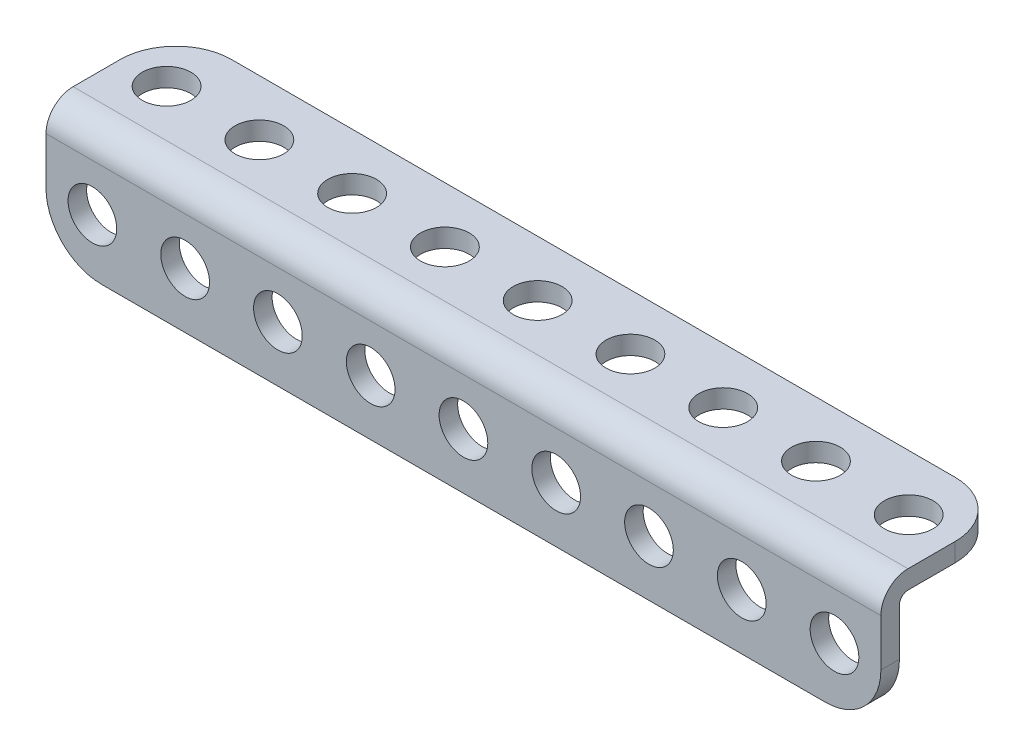
ISO-10303-21;
HEADER;
FILE_DESCRIPTION(('STEP AP214'),'2;1');
FILE_NAME('part.step','',(''),(''),'','','');
FILE_SCHEMA(('AUTOMOTIVE_DESIGN { 1 0 10303 214 1 1 1 1 }'));
ENDSEC;
DATA;
#1=APPLICATION_CONTEXT('core data for automotive mechanical design processes');
#2=APPLICATION_PROTOCOL_DEFINITION('international standard','automotive_design',2000,#1);
#3=PRODUCT_CONTEXT('',#1,'mechanical');
#4=PRODUCT('Part','Part','',(#3));
#5=PRODUCT_RELATED_PRODUCT_CATEGORY('part','',(#4));
#6=PRODUCT_DEFINITION_FORMATION('','',#4);
#7=PRODUCT_DEFINITION_CONTEXT('part definition',#1,'design');
#8=PRODUCT_DEFINITION('design','',#6,#7);
#9=PRODUCT_DEFINITION_SHAPE('','',#8);
#10=(LENGTH_UNIT() NAMED_UNIT(*) SI_UNIT(.MILLI.,.METRE.));
#11=(NAMED_UNIT(*) PLANE_ANGLE_UNIT() SI_UNIT($,.RADIAN.));
#12=(NAMED_UNIT(*) SI_UNIT($,.STERADIAN.) SOLID_ANGLE_UNIT());
#13=UNCERTAINTY_MEASURE_WITH_UNIT(LENGTH_MEASURE(1.E-05),#10,'distance_accuracy_value','');
#14=(GEOMETRIC_REPRESENTATION_CONTEXT(3) GLOBAL_UNCERTAINTY_ASSIGNED_CONTEXT((#13)) GLOBAL_UNIT_ASSIGNED_CONTEXT((#10,
#11,#12)) REPRESENTATION_CONTEXT('',''));
#15=CARTESIAN_POINT('',(0.,0.,0.));
#16=DIRECTION('',(0.,0.,1.));
#17=DIRECTION('',(1.,0.,0.));
#18=AXIS2_PLACEMENT_3D('',#15,#16,#17);
#19=CARTESIAN_POINT('',(16.9449941300397,-6.4,-3.1989870860874));
#20=DIRECTION('',(0.,0.,1.));
#21=DIRECTION('',(1.,0.,0.));
#22=AXIS2_PLACEMENT_3D('',#19,#20,#21);
#23=CYLINDRICAL_SURFACE('',#22,2.1);
#24=CARTESIAN_POINT('',(16.9449941300397,-6.4,-3.1989870860874));
#25=DIRECTION('',(0.,0.,1.));
#26=DIRECTION('',(1.,0.,0.));
#27=AXIS2_PLACEMENT_3D('',#24,#25,#26);
#28=CIRCLE('',#27,2.1);
#29=CARTESIAN_POINT('',(19.0449941300397,-6.4,-3.1989870860874));
#30=VERTEX_POINT('',#29);
#31=EDGE_CURVE('E264',#30,#30,#28,.F.);
#32=ORIENTED_EDGE('',*,*,#31,.T.);
#33=EDGE_LOOP('',(#32));
#34=FACE_BOUND('',#33,.T.);
#35=CARTESIAN_POINT('',(16.9449941300397,-6.4,-1.5989870860874));
#36=DIRECTION('',(0.,0.,1.));
#37=DIRECTION('',(1.,0.,0.));
#38=AXIS2_PLACEMENT_3D('',#35,#36,#37);
#39=CIRCLE('',#38,2.1);
#40=CARTESIAN_POINT('',(19.0449941300397,-6.4,-1.5989870860874));
#41=VERTEX_POINT('',#40);
#42=EDGE_CURVE('E294',#41,#41,#39,.F.);
#43=ORIENTED_EDGE('',*,*,#42,.F.);
#44=EDGE_LOOP('',(#43));
#45=FACE_BOUND('',#44,.T.);
#46=ADVANCED_FACE('F16',(#34,#45),#23,.F.);
#47=CARTESIAN_POINT('',(8.94499413003972,-6.4,-3.1989870860874));
#48=DIRECTION('',(0.,0.,1.));
#49=DIRECTION('',(1.,0.,0.));
#50=AXIS2_PLACEMENT_3D('',#47,#48,#49);
#51=CYLINDRICAL_SURFACE('',#50,2.1);
#52=CARTESIAN_POINT('',(8.94499413003972,-6.4,-3.1989870860874));
#53=DIRECTION('',(0.,0.,1.));
#54=DIRECTION('',(1.,0.,0.));
#55=AXIS2_PLACEMENT_3D('',#52,#53,#54);
#56=CIRCLE('',#55,2.1);
#57=CARTESIAN_POINT('',(11.0449941300397,-6.4,-3.1989870860874));
#58=VERTEX_POINT('',#57);
#59=EDGE_CURVE('E261',#58,#58,#56,.F.);
#60=ORIENTED_EDGE('',*,*,#59,.T.);
#61=EDGE_LOOP('',(#60));
#62=FACE_BOUND('',#61,.T.);
#63=CARTESIAN_POINT('',(8.94499413003972,-6.4,-1.5989870860874));
#64=DIRECTION('',(0.,0.,1.));
#65=DIRECTION('',(1.,0.,0.));
#66=AXIS2_PLACEMENT_3D('',#63,#64,#65);
#67=CIRCLE('',#66,2.1);
#68=CARTESIAN_POINT('',(11.0449941300397,-6.4,-1.5989870860874));
#69=VERTEX_POINT('',#68);
#70=EDGE_CURVE('E291',#69,#69,#67,.F.);
#71=ORIENTED_EDGE('',*,*,#70,.F.);
#72=EDGE_LOOP('',(#71));
#73=FACE_BOUND('',#72,.T.);
#74=ADVANCED_FACE('F625',(#62,#73),#51,.F.);
#75=CARTESIAN_POINT('',(0.94499413003972,-6.4,-3.1989870860874));
#76=DIRECTION('',(0.,0.,1.));
#77=DIRECTION('',(1.,0.,0.));
#78=AXIS2_PLACEMENT_3D('',#75,#76,#77);
#79=CYLINDRICAL_SURFACE('',#78,2.1);
#80=CARTESIAN_POINT('',(0.94499413003972,-6.4,-3.1989870860874));
#81=DIRECTION('',(0.,0.,1.));
#82=DIRECTION('',(1.,0.,0.));
#83=AXIS2_PLACEMENT_3D('',#80,#81,#82);
#84=CIRCLE('',#83,2.1);
#85=CARTESIAN_POINT('',(3.04499413003972,-6.4,-3.1989870860874));
#86=VERTEX_POINT('',#85);
#87=EDGE_CURVE('E258',#86,#86,#84,.F.);
#88=ORIENTED_EDGE('',*,*,#87,.T.);
#89=EDGE_LOOP('',(#88));
#90=FACE_BOUND('',#89,.T.);
#91=CARTESIAN_POINT('',(0.94499413003972,-6.4,-1.5989870860874));
#92=DIRECTION('',(0.,0.,1.));
#93=DIRECTION('',(1.,0.,0.));
#94=AXIS2_PLACEMENT_3D('',#91,#92,#93);
#95=CIRCLE('',#94,2.1);
#96=CARTESIAN_POINT('',(3.04499413003972,-6.4,-1.5989870860874));
#97=VERTEX_POINT('',#96);
#98=EDGE_CURVE('E288',#97,#97,#95,.F.);
#99=ORIENTED_EDGE('',*,*,#98,.F.);
#100=EDGE_LOOP('',(#99));
#101=FACE_BOUND('',#100,.T.);
#102=ADVANCED_FACE('F616',(#90,#101),#79,.F.);
#103=CARTESIAN_POINT('',(-7.05500586996028,-6.4,-3.1989870860874));
#104=DIRECTION('',(0.,0.,1.));
#105=DIRECTION('',(1.,0.,0.));
#106=AXIS2_PLACEMENT_3D('',#103,#104,#105);
#107=CYLINDRICAL_SURFACE('',#106,2.1);
#108=CARTESIAN_POINT('',(-7.05500586996028,-6.4,-3.1989870860874));
#109=DIRECTION('',(0.,0.,1.));
#110=DIRECTION('',(1.,0.,0.));
#111=AXIS2_PLACEMENT_3D('',#108,#109,#110);
#112=CIRCLE('',#111,2.1);
#113=CARTESIAN_POINT('',(-4.95500586996028,-6.4,-3.1989870860874));
#114=VERTEX_POINT('',#113);
#115=EDGE_CURVE('E255',#114,#114,#112,.F.);
#116=ORIENTED_EDGE('',*,*,#115,.T.);
#117=EDGE_LOOP('',(#116));
#118=FACE_BOUND('',#117,.T.);
#119=CARTESIAN_POINT('',(-7.05500586996028,-6.4,-1.5989870860874));
#120=DIRECTION('',(0.,0.,1.));
#121=DIRECTION('',(1.,0.,0.));
#122=AXIS2_PLACEMENT_3D('',#119,#120,#121);
#123=CIRCLE('',#122,2.1);
#124=CARTESIAN_POINT('',(-4.95500586996028,-6.4,-1.5989870860874));
#125=VERTEX_POINT('',#124);
#126=EDGE_CURVE('E285',#125,#125,#123,.F.);
#127=ORIENTED_EDGE('',*,*,#126,.F.);
#128=EDGE_LOOP('',(#127));
#129=FACE_BOUND('',#128,.T.);
#130=ADVANCED_FACE('F607',(#118,#129),#107,.F.);
#131=CARTESIAN_POINT('',(-15.0550058699603,-6.4,-3.1989870860874));
#132=DIRECTION('',(0.,0.,1.));
#133=DIRECTION('',(1.,0.,0.));
#134=AXIS2_PLACEMENT_3D('',#131,#132,#133);
#135=CYLINDRICAL_SURFACE('',#134,2.1);
#136=CARTESIAN_POINT('',(-15.0550058699603,-6.4,-3.1989870860874));
#137=DIRECTION('',(0.,0.,1.));
#138=DIRECTION('',(1.,0.,0.));
#139=AXIS2_PLACEMENT_3D('',#136,#137,#138);
#140=CIRCLE('',#139,2.1);
#141=CARTESIAN_POINT('',(-12.9550058699603,-6.4,-3.1989870860874));
#142=VERTEX_POINT('',#141);
#143=EDGE_CURVE('E252',#142,#142,#140,.F.);
#144=ORIENTED_EDGE('',*,*,#143,.T.);
#145=EDGE_LOOP('',(#144));
#146=FACE_BOUND('',#145,.T.);
#147=CARTESIAN_POINT('',(-15.0550058699603,-6.4,-1.5989870860874));
#148=DIRECTION('',(0.,0.,1.));
#149=DIRECTION('',(1.,0.,0.));
#150=AXIS2_PLACEMENT_3D('',#147,#148,#149);
#151=CIRCLE('',#150,2.1);
#152=CARTESIAN_POINT('',(-12.9550058699603,-6.4,-1.5989870860874));
#153=VERTEX_POINT('',#152);
#154=EDGE_CURVE('E282',#153,#153,#151,.F.);
#155=ORIENTED_EDGE('',*,*,#154,.F.);
#156=EDGE_LOOP('',(#155));
#157=FACE_BOUND('',#156,.T.);
#158=ADVANCED_FACE('F598',(#146,#157),#135,.F.);
#159=CARTESIAN_POINT('',(-23.0550058699603,-6.4,-3.1989870860874));
#160=DIRECTION('',(0.,0.,1.));
#161=DIRECTION('',(1.,0.,0.));
#162=AXIS2_PLACEMENT_3D('',#159,#160,#161);
#163=CYLINDRICAL_SURFACE('',#162,2.1);
#164=CARTESIAN_POINT('',(-23.0550058699603,-6.4,-3.1989870860874));
#165=DIRECTION('',(0.,0.,1.));
#166=DIRECTION('',(1.,0.,0.));
#167=AXIS2_PLACEMENT_3D('',#164,#165,#166);
#168=CIRCLE('',#167,2.1);
#169=CARTESIAN_POINT('',(-20.9550058699603,-6.4,-3.1989870860874));
#170=VERTEX_POINT('',#169);
#171=EDGE_CURVE('E249',#170,#170,#168,.F.);
#172=ORIENTED_EDGE('',*,*,#171,.T.);
#173=EDGE_LOOP('',(#172));
#174=FACE_BOUND('',#173,.T.);
#175=CARTESIAN_POINT('',(-23.0550058699603,-6.4,-1.5989870860874));
#176=DIRECTION('',(0.,0.,1.));
#177=DIRECTION('',(1.,0.,0.));
#178=AXIS2_PLACEMENT_3D('',#175,#176,#177);
#179=CIRCLE('',#178,2.1);
#180=CARTESIAN_POINT('',(-20.9550058699603,-6.4,-1.5989870860874));
#181=VERTEX_POINT('',#180);
#182=EDGE_CURVE('E279',#181,#181,#179,.F.);
#183=ORIENTED_EDGE('',*,*,#182,.F.);
#184=EDGE_LOOP('',(#183));
#185=FACE_BOUND('',#184,.T.);
#186=ADVANCED_FACE('F355',(#174,#185),#163,.F.);
#187=CARTESIAN_POINT('',(-31.0550058699603,-6.4,-3.1989870860874));
#188=DIRECTION('',(0.,0.,1.));
#189=DIRECTION('',(1.,0.,0.));
#190=AXIS2_PLACEMENT_3D('',#187,#188,#189);
#191=CYLINDRICAL_SURFACE('',#190,2.1);
#192=CARTESIAN_POINT('',(-31.0550058699603,-6.4,-3.1989870860874));
#193=DIRECTION('',(0.,0.,1.));
#194=DIRECTION('',(1.,0.,0.));
#195=AXIS2_PLACEMENT_3D('',#192,#193,#194);
#196=CIRCLE('',#195,2.1);
#197=CARTESIAN_POINT('',(-28.9550058699603,-6.4,-3.1989870860874));
#198=VERTEX_POINT('',#197);
#199=EDGE_CURVE('E122',#198,#198,#196,.F.);
#200=ORIENTED_EDGE('',*,*,#199,.T.);
#201=EDGE_LOOP('',(#200));
#202=FACE_BOUND('',#201,.T.);
#203=CARTESIAN_POINT('',(-31.0550058699603,-6.4,-1.5989870860874));
#204=DIRECTION('',(0.,0.,1.));
#205=DIRECTION('',(1.,0.,0.));
#206=AXIS2_PLACEMENT_3D('',#203,#204,#205);
#207=CIRCLE('',#206,2.1);
#208=CARTESIAN_POINT('',(-28.9550058699603,-6.4,-1.5989870860874));
#209=VERTEX_POINT('',#208);
#210=EDGE_CURVE('E276',#209,#209,#207,.F.);
#211=ORIENTED_EDGE('',*,*,#210,.F.);
#212=EDGE_LOOP('',(#211));
#213=FACE_BOUND('',#212,.T.);
#214=ADVANCED_FACE('F347',(#202,#213),#191,.F.);
#215=CARTESIAN_POINT('',(-46.2550058699603,-6.4,-11.5989870860874));
#216=DIRECTION('',(0.,0.,1.));
#217=DIRECTION('',(1.,0.,0.));
#218=AXIS2_PLACEMENT_3D('',#215,#216,#217);
#219=CYLINDRICAL_SURFACE('',#218,4.8);
#220=CARTESIAN_POINT('',(-46.2550058699603,-6.4,-1.59898708608737));
#221=DIRECTION('',(0.,0.,1.));
#222=DIRECTION('',(1.,0.,0.));
#223=AXIS2_PLACEMENT_3D('',#220,#221,#222);
#224=CIRCLE('',#223,4.8);
#225=CARTESIAN_POINT('',(-51.0550058699603,-6.4,-1.59898708608738));
#226=VERTEX_POINT('',#225);
#227=CARTESIAN_POINT('',(-46.2550058699603,-11.2,-1.59898708608736));
#228=VERTEX_POINT('',#227);
#229=EDGE_CURVE('E172',#226,#228,#224,.T.);
#230=ORIENTED_EDGE('',*,*,#229,.F.);
#231=DIRECTION('',(0.,0.,1.));
#232=VECTOR('',#231,1.);
#233=CARTESIAN_POINT('',(-51.0550058699603,-6.4,-11.5989870860874));
#234=LINE('',#233,#232);
#235=CARTESIAN_POINT('',(-51.0550058699603,-6.4,-3.19898708608738));
#236=VERTEX_POINT('',#235);
#237=EDGE_CURVE('E179',#226,#236,#234,.F.);
#238=ORIENTED_EDGE('',*,*,#237,.T.);
#239=CARTESIAN_POINT('',(-46.2550058699603,-6.4,-3.19898708608738));
#240=DIRECTION('',(0.,0.,1.));
#241=DIRECTION('',(1.,0.,0.));
#242=AXIS2_PLACEMENT_3D('',#239,#240,#241);
#243=CIRCLE('',#242,4.8);
#244=CARTESIAN_POINT('',(-46.2550058699603,-11.2,-3.19898708608737));
#245=VERTEX_POINT('',#244);
#246=EDGE_CURVE('E121',#236,#245,#243,.T.);
#247=ORIENTED_EDGE('',*,*,#246,.T.);
#248=DIRECTION('',(0.,0.,1.));
#249=VECTOR('',#248,1.);
#250=CARTESIAN_POINT('',(-46.2550058699603,-11.2,-11.5989870860874));
#251=LINE('',#250,#249);
#252=EDGE_CURVE('E175',#245,#228,#251,.T.);
#253=ORIENTED_EDGE('',*,*,#252,.T.);
#254=EDGE_LOOP('',(#230,#238,#247,#253));
#255=FACE_BOUND('',#254,.T.);
#256=ADVANCED_FACE('F345',(#255),#219,.T.);
#257=CARTESIAN_POINT('',(-54.6727360152985,-11.2,-11.5989870860874));
#258=DIRECTION('',(0.,1.,0.));
#259=DIRECTION('',(0.,0.,1.));
#260=AXIS2_PLACEMENT_3D('',#257,#258,#259);
#261=PLANE('',#260);
#262=DIRECTION('',(1.,0.,0.));
#263=VECTOR('',#262,1.);
#264=CARTESIAN_POINT('',(-51.0550058699603,-11.2,-1.59898708608735));
#265=LINE('',#264,#263);
#266=CARTESIAN_POINT('',(16.1449941300397,-11.2,-1.59898708608737));
#267=VERTEX_POINT('',#266);
#268=EDGE_CURVE('E169',#228,#267,#265,.T.);
#269=ORIENTED_EDGE('',*,*,#268,.F.);
#270=ORIENTED_EDGE('',*,*,#252,.F.);
#271=DIRECTION('',(1.,0.,0.));
#272=VECTOR('',#271,1.);
#273=CARTESIAN_POINT('',(-51.0550058699603,-11.2,-3.19898708608735));
#274=LINE('',#273,#272);
#275=CARTESIAN_POINT('',(16.1449941300397,-11.2,-3.19898708608736));
#276=VERTEX_POINT('',#275);
#277=EDGE_CURVE('E160',#245,#276,#274,.T.);
#278=ORIENTED_EDGE('',*,*,#277,.T.);
#279=DIRECTION('',(0.,0.,-1.));
#280=VECTOR('',#279,1.);
#281=CARTESIAN_POINT('',(16.1449941300397,-11.2,-11.5989870860874));
#282=LINE('',#281,#280);
#283=EDGE_CURVE('E173',#267,#276,#282,.T.);
#284=ORIENTED_EDGE('',*,*,#283,.F.);
#285=EDGE_LOOP('',(#269,#270,#278,#284));
#286=FACE_BOUND('',#285,.T.);
#287=ADVANCED_FACE('F342',(#286),#261,.F.);
#288=CARTESIAN_POINT('',(16.1449941300397,-6.4,-11.5989870860874));
#289=DIRECTION('',(0.,0.,-1.));
#290=DIRECTION('',(-1.,0.,0.));
#291=AXIS2_PLACEMENT_3D('',#288,#289,#290);
#292=CYLINDRICAL_SURFACE('',#291,4.8);
#293=CARTESIAN_POINT('',(16.1449941300397,-6.4,-3.19898708608736));
#294=DIRECTION('',(0.,0.,-1.));
#295=DIRECTION('',(-1.,0.,0.));
#296=AXIS2_PLACEMENT_3D('',#293,#294,#295);
#297=CIRCLE('',#296,4.8);
#298=CARTESIAN_POINT('',(20.9449941300397,-6.4,-3.19898708608736));
#299=VERTEX_POINT('',#298);
#300=EDGE_CURVE('E162',#276,#299,#297,.F.);
#301=ORIENTED_EDGE('',*,*,#300,.T.);
#302=DIRECTION('',(0.,0.,-1.));
#303=VECTOR('',#302,1.);
#304=CARTESIAN_POINT('',(20.9449941300397,-6.4,-11.5989870860874));
#305=LINE('',#304,#303);
#306=CARTESIAN_POINT('',(20.9449941300397,-6.4,-1.59898708608738));
#307=VERTEX_POINT('',#306);
#308=EDGE_CURVE('E114',#299,#307,#305,.F.);
#309=ORIENTED_EDGE('',*,*,#308,.T.);
#310=CARTESIAN_POINT('',(16.1449941300397,-6.4,-1.59898708608738));
#311=DIRECTION('',(0.,0.,-1.));
#312=DIRECTION('',(-1.,0.,0.));
#313=AXIS2_PLACEMENT_3D('',#310,#311,#312);
#314=CIRCLE('',#313,4.8);
#315=EDGE_CURVE('E171',#267,#307,#314,.F.);
#316=ORIENTED_EDGE('',*,*,#315,.F.);
#317=ORIENTED_EDGE('',*,*,#283,.T.);
#318=EDGE_LOOP('',(#301,#309,#316,#317));
#319=FACE_BOUND('',#318,.T.);
#320=ADVANCED_FACE('F338',(#319),#292,.T.);
#321=CARTESIAN_POINT('',(-47.0550058699603,-6.4,-3.1989870860874));
#322=DIRECTION('',(0.,0.,1.));
#323=DIRECTION('',(1.,0.,0.));
#324=AXIS2_PLACEMENT_3D('',#321,#322,#323);
#325=CYLINDRICAL_SURFACE('',#324,2.1);
#326=CARTESIAN_POINT('',(-47.0550058699603,-6.4,-3.1989870860874));
#327=DIRECTION('',(0.,0.,1.));
#328=DIRECTION('',(1.,0.,0.));
#329=AXIS2_PLACEMENT_3D('',#326,#327,#328);
#330=CIRCLE('',#329,2.1);
#331=CARTESIAN_POINT('',(-44.9550058699603,-6.4,-3.1989870860874));
#332=VERTEX_POINT('',#331);
#333=EDGE_CURVE('E241',#332,#332,#330,.F.);
#334=ORIENTED_EDGE('',*,*,#333,.T.);
#335=EDGE_LOOP('',(#334));
#336=FACE_BOUND('',#335,.T.);
#337=CARTESIAN_POINT('',(-47.0550058699603,-6.4,-1.5989870860874));
#338=DIRECTION('',(0.,0.,1.));
#339=DIRECTION('',(1.,0.,0.));
#340=AXIS2_PLACEMENT_3D('',#337,#338,#339);
#341=CIRCLE('',#340,2.1);
#342=CARTESIAN_POINT('',(-44.9550058699603,-6.4,-1.5989870860874));
#343=VERTEX_POINT('',#342);
#344=EDGE_CURVE('E273',#343,#343,#341,.F.);
#345=ORIENTED_EDGE('',*,*,#344,.F.);
#346=EDGE_LOOP('',(#345));
#347=FACE_BOUND('',#346,.T.);
#348=ADVANCED_FACE('F428',(#336,#347),#325,.F.);
#349=CARTESIAN_POINT('',(-39.0550058699603,-6.4,-3.1989870860874));
#350=DIRECTION('',(0.,0.,1.));
#351=DIRECTION('',(1.,0.,0.));
#352=AXIS2_PLACEMENT_3D('',#349,#350,#351);
#353=CYLINDRICAL_SURFACE('',#352,2.1);
#354=CARTESIAN_POINT('',(-39.0550058699603,-6.4,-3.1989870860874));
#355=DIRECTION('',(0.,0.,1.));
#356=DIRECTION('',(1.,0.,0.));
#357=AXIS2_PLACEMENT_3D('',#354,#355,#356);
#358=CIRCLE('',#357,2.1);
#359=CARTESIAN_POINT('',(-36.9550058699603,-6.4,-3.1989870860874));
#360=VERTEX_POINT('',#359);
#361=EDGE_CURVE('E167',#360,#360,#358,.F.);
#362=ORIENTED_EDGE('',*,*,#361,.T.);
#363=EDGE_LOOP('',(#362));
#364=FACE_BOUND('',#363,.T.);
#365=CARTESIAN_POINT('',(-39.0550058699603,-6.4,-1.5989870860874));
#366=DIRECTION('',(0.,0.,1.));
#367=DIRECTION('',(1.,0.,0.));
#368=AXIS2_PLACEMENT_3D('',#365,#366,#367);
#369=CIRCLE('',#368,2.1);
#370=CARTESIAN_POINT('',(-36.9550058699603,-6.4,-1.5989870860874));
#371=VERTEX_POINT('',#370);
#372=EDGE_CURVE('E270',#371,#371,#369,.F.);
#373=ORIENTED_EDGE('',*,*,#372,.F.);
#374=EDGE_LOOP('',(#373));
#375=FACE_BOUND('',#374,.T.);
#376=ADVANCED_FACE('F425',(#364,#375),#353,.F.);
#377=CARTESIAN_POINT('',(-51.0550058699603,-2.3366,-3.93558708608739));
#378=DIRECTION('',(-1.,0.,0.));
#379=DIRECTION('',(0.,0.,1.));
#380=AXIS2_PLACEMENT_3D('',#377,#378,#379);
#381=CYLINDRICAL_SURFACE('',#380,0.736599999999995);
#382=DIRECTION('',(1.,0.,0.));
#383=VECTOR('',#382,1.);
#384=CARTESIAN_POINT('',(-51.0550058699603,-2.3366,-3.19898708608738));
#385=LINE('',#384,#383);
#386=CARTESIAN_POINT('',(20.9449941300397,-2.3366,-3.19898708608738));
#387=VERTEX_POINT('',#386);
#388=CARTESIAN_POINT('',(-51.0550058699603,-2.3366,-3.19898708608738));
#389=VERTEX_POINT('',#388);
#390=EDGE_CURVE('E116',#387,#389,#385,.F.);
#391=ORIENTED_EDGE('',*,*,#390,.T.);
#392=CARTESIAN_POINT('',(-51.0550058699603,-2.3366,-3.93558708608739));
#393=DIRECTION('',(-1.,0.,0.));
#394=DIRECTION('',(0.,0.,1.));
#395=AXIS2_PLACEMENT_3D('',#392,#393,#394);
#396=CIRCLE('',#395,0.736599999999995);
#397=CARTESIAN_POINT('',(-51.0550058699603,-1.6,-3.93558708608738));
#398=VERTEX_POINT('',#397);
#399=EDGE_CURVE('E19',#398,#389,#396,.F.);
#400=ORIENTED_EDGE('',*,*,#399,.F.);
#401=DIRECTION('',(1.,0.,0.));
#402=VECTOR('',#401,1.);
#403=CARTESIAN_POINT('',(7.54499413003971,-1.6,-3.93558708608738));
#404=LINE('',#403,#402);
#405=CARTESIAN_POINT('',(20.9449941300397,-1.6,-3.93558708608738));
#406=VERTEX_POINT('',#405);
#407=EDGE_CURVE('E164',#406,#398,#404,.F.);
#408=ORIENTED_EDGE('',*,*,#407,.F.);
#409=CARTESIAN_POINT('',(20.9449941300397,-2.3366,-3.93558708608739));
#410=DIRECTION('',(-1.,0.,0.));
#411=DIRECTION('',(0.,0.,1.));
#412=AXIS2_PLACEMENT_3D('',#409,#410,#411);
#413=CIRCLE('',#412,0.736599999999995);
#414=EDGE_CURVE('E113',#387,#406,#413,.T.);
#415=ORIENTED_EDGE('',*,*,#414,.F.);
#416=EDGE_LOOP('',(#391,#400,#408,#415));
#417=FACE_BOUND('',#416,.T.);
#418=ADVANCED_FACE('F117',(#417),#381,.F.);
#419=CARTESIAN_POINT('',(-51.0550058699603,-1.59999999999999,-1.59898708608738));
#420=DIRECTION('',(0.,0.,1.));
#421=DIRECTION('',(0.,-1.,0.));
#422=AXIS2_PLACEMENT_3D('',#419,#420,#421);
#423=PLANE('',#422);
#424=DIRECTION('',(0.,1.,0.));
#425=VECTOR('',#424,1.);
#426=CARTESIAN_POINT('',(20.9449941300397,-15.,-1.59898708608739));
#427=LINE('',#426,#425);
#428=CARTESIAN_POINT('',(20.9449941300397,-2.3366,-1.59898708608739));
#429=VERTEX_POINT('',#428);
#430=EDGE_CURVE('E146',#429,#307,#427,.F.);
#431=ORIENTED_EDGE('',*,*,#430,.F.);
#432=DIRECTION('',(-1.,0.,0.));
#433=VECTOR('',#432,1.);
#434=CARTESIAN_POINT('',(-51.0550058699603,-2.3366,-1.59898708608739));
#435=LINE('',#434,#433);
#436=CARTESIAN_POINT('',(-51.0550058699603,-2.3366,-1.59898708608739));
#437=VERTEX_POINT('',#436);
#438=EDGE_CURVE('E149',#437,#429,#435,.F.);
#439=ORIENTED_EDGE('',*,*,#438,.F.);
#440=DIRECTION('',(0.,1.,0.));
#441=VECTOR('',#440,1.);
#442=CARTESIAN_POINT('',(-51.0550058699603,-1.59999999999999,-1.59898708608738));
#443=LINE('',#442,#441);
#444=EDGE_CURVE('E138',#226,#437,#443,.T.);
#445=ORIENTED_EDGE('',*,*,#444,.F.);
#446=ORIENTED_EDGE('',*,*,#229,.T.);
#447=ORIENTED_EDGE('',*,*,#268,.T.);
#448=ORIENTED_EDGE('',*,*,#315,.T.);
#449=EDGE_LOOP('',(#431,#439,#445,#446,#447,#448));
#450=FACE_BOUND('',#449,.T.);
#451=ORIENTED_EDGE('',*,*,#372,.T.);
#452=EDGE_LOOP('',(#451));
#453=FACE_BOUND('',#452,.T.);
#454=ORIENTED_EDGE('',*,*,#344,.T.);
#455=EDGE_LOOP('',(#454));
#456=FACE_BOUND('',#455,.T.);
#457=ORIENTED_EDGE('',*,*,#210,.T.);
#458=EDGE_LOOP('',(#457));
#459=FACE_BOUND('',#458,.T.);
#460=ORIENTED_EDGE('',*,*,#182,.T.);
#461=EDGE_LOOP('',(#460));
#462=FACE_BOUND('',#461,.T.);
#463=ORIENTED_EDGE('',*,*,#154,.T.);
#464=EDGE_LOOP('',(#463));
#465=FACE_BOUND('',#464,.T.);
#466=ORIENTED_EDGE('',*,*,#126,.T.);
#467=EDGE_LOOP('',(#466));
#468=FACE_BOUND('',#467,.T.);
#469=ORIENTED_EDGE('',*,*,#98,.T.);
#470=EDGE_LOOP('',(#469));
#471=FACE_BOUND('',#470,.T.);
#472=ORIENTED_EDGE('',*,*,#70,.T.);
#473=EDGE_LOOP('',(#472));
#474=FACE_BOUND('',#473,.T.);
#475=ORIENTED_EDGE('',*,*,#42,.T.);
#476=EDGE_LOOP('',(#475));
#477=FACE_BOUND('',#476,.T.);
#478=ADVANCED_FACE('F333',(#450,#453,#456,#459,#462,#465,#468,#471,#474,#477),#423,.T.);
#479=CARTESIAN_POINT('',(-51.0550058699603,-1.6,-3.19898708608738));
#480=DIRECTION('',(0.,0.,1.));
#481=DIRECTION('',(0.,-1.,0.));
#482=AXIS2_PLACEMENT_3D('',#479,#480,#481);
#483=PLANE('',#482);
#484=ORIENTED_EDGE('',*,*,#361,.F.);
#485=EDGE_LOOP('',(#484));
#486=FACE_BOUND('',#485,.T.);
#487=ORIENTED_EDGE('',*,*,#333,.F.);
#488=EDGE_LOOP('',(#487));
#489=FACE_BOUND('',#488,.T.);
#490=ORIENTED_EDGE('',*,*,#277,.F.);
#491=ORIENTED_EDGE('',*,*,#246,.F.);
#492=DIRECTION('',(0.,1.,0.));
#493=VECTOR('',#492,1.);
#494=CARTESIAN_POINT('',(-51.0550058699603,-1.59999999999999,-3.19898708608739));
#495=LINE('',#494,#493);
#496=EDGE_CURVE('E109',#389,#236,#495,.F.);
#497=ORIENTED_EDGE('',*,*,#496,.F.);
#498=ORIENTED_EDGE('',*,*,#390,.F.);
#499=DIRECTION('',(0.,1.,0.));
#500=VECTOR('',#499,1.);
#501=CARTESIAN_POINT('',(20.9449941300397,-15.,-3.19898708608737));
#502=LINE('',#501,#500);
#503=EDGE_CURVE('E152',#299,#387,#502,.T.);
#504=ORIENTED_EDGE('',*,*,#503,.F.);
#505=ORIENTED_EDGE('',*,*,#300,.F.);
#506=EDGE_LOOP('',(#490,#491,#497,#498,#504,#505));
#507=FACE_BOUND('',#506,.T.);
#508=ORIENTED_EDGE('',*,*,#199,.F.);
#509=EDGE_LOOP('',(#508));
#510=FACE_BOUND('',#509,.T.);
#511=ORIENTED_EDGE('',*,*,#171,.F.);
#512=EDGE_LOOP('',(#511));
#513=FACE_BOUND('',#512,.T.);
#514=ORIENTED_EDGE('',*,*,#143,.F.);
#515=EDGE_LOOP('',(#514));
#516=FACE_BOUND('',#515,.T.);
#517=ORIENTED_EDGE('',*,*,#115,.F.);
#518=EDGE_LOOP('',(#517));
#519=FACE_BOUND('',#518,.T.);
#520=ORIENTED_EDGE('',*,*,#87,.F.);
#521=EDGE_LOOP('',(#520));
#522=FACE_BOUND('',#521,.T.);
#523=ORIENTED_EDGE('',*,*,#59,.F.);
#524=EDGE_LOOP('',(#523));
#525=FACE_BOUND('',#524,.T.);
#526=ORIENTED_EDGE('',*,*,#31,.F.);
#527=EDGE_LOOP('',(#526));
#528=FACE_BOUND('',#527,.T.);
#529=ADVANCED_FACE('F126',(#486,#489,#507,#510,#513,#516,#519,#522,#525,#528),#483,.F.);
#530=CARTESIAN_POINT('',(7.54499413003971,-1.6,-45.5989870860874));
#531=DIRECTION('',(0.,-1.,0.));
#532=DIRECTION('',(0.,0.,-1.));
#533=AXIS2_PLACEMENT_3D('',#530,#531,#532);
#534=PLANE('',#533);
#535=DIRECTION('',(0.,0.,-1.));
#536=VECTOR('',#535,1.);
#537=CARTESIAN_POINT('',(20.9449941300397,-1.6,-1.59898708608735));
#538=LINE('',#537,#536);
#539=CARTESIAN_POINT('',(20.9449941300397,-1.6,-7.99898708608738));
#540=VERTEX_POINT('',#539);
#541=EDGE_CURVE('E150',#406,#540,#538,.T.);
#542=ORIENTED_EDGE('',*,*,#541,.F.);
#543=ORIENTED_EDGE('',*,*,#407,.T.);
#544=DIRECTION('',(0.,0.,1.));
#545=VECTOR('',#544,1.);
#546=CARTESIAN_POINT('',(-51.0550058699603,-1.6,-1.59898708608738));
#547=LINE('',#546,#545);
#548=CARTESIAN_POINT('',(-51.0550058699603,-1.6,-7.99898708608738));
#549=VERTEX_POINT('',#548);
#550=EDGE_CURVE('E112',#549,#398,#547,.T.);
#551=ORIENTED_EDGE('',*,*,#550,.F.);
#552=CARTESIAN_POINT('',(-46.2550058699603,-1.6,-7.99898708608738));
#553=DIRECTION('',(0.,-1.,0.));
#554=DIRECTION('',(0.,0.,-1.));
#555=AXIS2_PLACEMENT_3D('',#552,#553,#554);
#556=CIRCLE('',#555,4.8);
#557=CARTESIAN_POINT('',(-46.2550058699603,-1.6,-12.7989870860874));
#558=VERTEX_POINT('',#557);
#559=EDGE_CURVE('E129',#558,#549,#556,.F.);
#560=ORIENTED_EDGE('',*,*,#559,.F.);
#561=DIRECTION('',(1.,0.,0.));
#562=VECTOR('',#561,1.);
#563=CARTESIAN_POINT('',(-55.1982840381761,-1.6,-12.7989870860874));
#564=LINE('',#563,#562);
#565=CARTESIAN_POINT('',(16.1449941300397,-1.6,-12.7989870860874));
#566=VERTEX_POINT('',#565);
#567=EDGE_CURVE('E155',#558,#566,#564,.T.);
#568=ORIENTED_EDGE('',*,*,#567,.T.);
#569=CARTESIAN_POINT('',(16.1449941300397,-1.6,-7.99898708608738));
#570=DIRECTION('',(0.,1.,0.));
#571=DIRECTION('',(0.,0.,1.));
#572=AXIS2_PLACEMENT_3D('',#569,#570,#571);
#573=CIRCLE('',#572,4.8);
#574=EDGE_CURVE('E158',#540,#566,#573,.T.);
#575=ORIENTED_EDGE('',*,*,#574,.F.);
#576=EDGE_LOOP('',(#542,#543,#551,#560,#568,#575));
#577=FACE_BOUND('',#576,.T.);
#578=CARTESIAN_POINT('',(-39.0550058699603,-1.6,-7.99898708608738));
#579=DIRECTION('',(0.,1.,0.));
#580=DIRECTION('',(0.,0.,1.));
#581=AXIS2_PLACEMENT_3D('',#578,#579,#580);
#582=CIRCLE('',#581,2.1);
#583=CARTESIAN_POINT('',(-39.0550058699603,-1.6,-5.89898708608739));
#584=VERTEX_POINT('',#583);
#585=EDGE_CURVE('E210',#584,#584,#582,.T.);
#586=ORIENTED_EDGE('',*,*,#585,.T.);
#587=EDGE_LOOP('',(#586));
#588=FACE_BOUND('',#587,.T.);
#589=CARTESIAN_POINT('',(-47.0550058699603,-1.6,-7.99898708608738));
#590=DIRECTION('',(0.,1.,0.));
#591=DIRECTION('',(0.,0.,1.));
#592=AXIS2_PLACEMENT_3D('',#589,#590,#591);
#593=CIRCLE('',#592,2.1);
#594=CARTESIAN_POINT('',(-47.0550058699603,-1.6,-5.89898708608739));
#595=VERTEX_POINT('',#594);
#596=EDGE_CURVE('E213',#595,#595,#593,.T.);
#597=ORIENTED_EDGE('',*,*,#596,.T.);
#598=EDGE_LOOP('',(#597));
#599=FACE_BOUND('',#598,.T.);
#600=CARTESIAN_POINT('',(-31.0550058699603,-1.6,-7.99898708608738));
#601=DIRECTION('',(0.,1.,0.));
#602=DIRECTION('',(0.,0.,1.));
#603=AXIS2_PLACEMENT_3D('',#600,#601,#602);
#604=CIRCLE('',#603,2.1);
#605=CARTESIAN_POINT('',(-31.0550058699603,-1.6,-5.89898708608739));
#606=VERTEX_POINT('',#605);
#607=EDGE_CURVE('E154',#606,#606,#604,.T.);
#608=ORIENTED_EDGE('',*,*,#607,.T.);
#609=EDGE_LOOP('',(#608));
#610=FACE_BOUND('',#609,.T.);
#611=CARTESIAN_POINT('',(-23.0550058699603,-1.6,-7.99898708608738));
#612=DIRECTION('',(0.,1.,0.));
#613=DIRECTION('',(0.,0.,1.));
#614=AXIS2_PLACEMENT_3D('',#611,#612,#613);
#615=CIRCLE('',#614,2.1);
#616=CARTESIAN_POINT('',(-23.0550058699603,-1.6,-5.89898708608739));
#617=VERTEX_POINT('',#616);
#618=EDGE_CURVE('E222',#617,#617,#615,.T.);
#619=ORIENTED_EDGE('',*,*,#618,.T.);
#620=EDGE_LOOP('',(#619));
#621=FACE_BOUND('',#620,.T.);
#622=CARTESIAN_POINT('',(-15.0550058699603,-1.6,-7.99898708608738));
#623=DIRECTION('',(0.,1.,0.));
#624=DIRECTION('',(0.,0.,1.));
#625=AXIS2_PLACEMENT_3D('',#622,#623,#624);
#626=CIRCLE('',#625,2.1);
#627=CARTESIAN_POINT('',(-15.0550058699603,-1.6,-5.89898708608739));
#628=VERTEX_POINT('',#627);
#629=EDGE_CURVE('E225',#628,#628,#626,.T.);
#630=ORIENTED_EDGE('',*,*,#629,.T.);
#631=EDGE_LOOP('',(#630));
#632=FACE_BOUND('',#631,.T.);
#633=CARTESIAN_POINT('',(-7.05500586996028,-1.6,-7.99898708608738));
#634=DIRECTION('',(0.,1.,0.));
#635=DIRECTION('',(0.,0.,1.));
#636=AXIS2_PLACEMENT_3D('',#633,#634,#635);
#637=CIRCLE('',#636,2.1);
#638=CARTESIAN_POINT('',(-7.05500586996028,-1.6,-5.89898708608739));
#639=VERTEX_POINT('',#638);
#640=EDGE_CURVE('E228',#639,#639,#637,.T.);
#641=ORIENTED_EDGE('',*,*,#640,.T.);
#642=EDGE_LOOP('',(#641));
#643=FACE_BOUND('',#642,.T.);
#644=CARTESIAN_POINT('',(0.94499413003972,-1.6,-7.99898708608738));
#645=DIRECTION('',(0.,1.,0.));
#646=DIRECTION('',(0.,0.,1.));
#647=AXIS2_PLACEMENT_3D('',#644,#645,#646);
#648=CIRCLE('',#647,2.1);
#649=CARTESIAN_POINT('',(0.94499413003972,-1.6,-5.89898708608739));
#650=VERTEX_POINT('',#649);
#651=EDGE_CURVE('E231',#650,#650,#648,.T.);
#652=ORIENTED_EDGE('',*,*,#651,.T.);
#653=EDGE_LOOP('',(#652));
#654=FACE_BOUND('',#653,.T.);
#655=CARTESIAN_POINT('',(8.94499413003972,-1.6,-7.99898708608738));
#656=DIRECTION('',(0.,1.,0.));
#657=DIRECTION('',(0.,0.,1.));
#658=AXIS2_PLACEMENT_3D('',#655,#656,#657);
#659=CIRCLE('',#658,2.1);
#660=CARTESIAN_POINT('',(8.94499413003972,-1.6,-5.89898708608739));
#661=VERTEX_POINT('',#660);
#662=EDGE_CURVE('E234',#661,#661,#659,.T.);
#663=ORIENTED_EDGE('',*,*,#662,.T.);
#664=EDGE_LOOP('',(#663));
#665=FACE_BOUND('',#664,.T.);
#666=CARTESIAN_POINT('',(16.9449941300397,-1.6,-7.99898708608738));
#667=DIRECTION('',(0.,1.,0.));
#668=DIRECTION('',(0.,0.,1.));
#669=AXIS2_PLACEMENT_3D('',#666,#667,#668);
#670=CIRCLE('',#669,2.1);
#671=CARTESIAN_POINT('',(16.9449941300397,-1.6,-5.89898708608739));
#672=VERTEX_POINT('',#671);
#673=EDGE_CURVE('E166',#672,#672,#670,.T.);
#674=ORIENTED_EDGE('',*,*,#673,.T.);
#675=EDGE_LOOP('',(#674));
#676=FACE_BOUND('',#675,.T.);
#677=ADVANCED_FACE('F303',(#577,#588,#599,#610,#621,#632,#643,#654,#665,#676),#534,.T.);
#678=CARTESIAN_POINT('',(16.9449941300397,-1.6,-7.99898708608738));
#679=DIRECTION('',(0.,1.,0.));
#680=DIRECTION('',(0.,0.,1.));
#681=AXIS2_PLACEMENT_3D('',#678,#679,#680);
#682=CYLINDRICAL_SURFACE('',#681,2.1);
#683=ORIENTED_EDGE('',*,*,#673,.F.);
#684=EDGE_LOOP('',(#683));
#685=FACE_BOUND('',#684,.T.);
#686=CARTESIAN_POINT('',(16.9449941300397,0.,-7.99898708608738));
#687=DIRECTION('',(0.,1.,0.));
#688=DIRECTION('',(0.,0.,1.));
#689=AXIS2_PLACEMENT_3D('',#686,#687,#688);
#690=CIRCLE('',#689,2.1);
#691=CARTESIAN_POINT('',(16.9449941300397,0.,-5.89898708608739));
#692=VERTEX_POINT('',#691);
#693=EDGE_CURVE('E207',#692,#692,#690,.T.);
#694=ORIENTED_EDGE('',*,*,#693,.T.);
#695=EDGE_LOOP('',(#694));
#696=FACE_BOUND('',#695,.T.);
#697=ADVANCED_FACE('F411',(#685,#696),#682,.F.);
#698=CARTESIAN_POINT('',(8.94499413003972,-1.6,-7.99898708608738));
#699=DIRECTION('',(0.,1.,0.));
#700=DIRECTION('',(0.,0.,1.));
#701=AXIS2_PLACEMENT_3D('',#698,#699,#700);
#702=CYLINDRICAL_SURFACE('',#701,2.1);
#703=ORIENTED_EDGE('',*,*,#662,.F.);
#704=EDGE_LOOP('',(#703));
#705=FACE_BOUND('',#704,.T.);
#706=CARTESIAN_POINT('',(8.94499413003972,0.,-7.99898708608738));
#707=DIRECTION('',(0.,1.,0.));
#708=DIRECTION('',(0.,0.,1.));
#709=AXIS2_PLACEMENT_3D('',#706,#707,#708);
#710=CIRCLE('',#709,2.1);
#711=CARTESIAN_POINT('',(8.94499413003972,0.,-5.89898708608739));
#712=VERTEX_POINT('',#711);
#713=EDGE_CURVE('E204',#712,#712,#710,.T.);
#714=ORIENTED_EDGE('',*,*,#713,.T.);
#715=EDGE_LOOP('',(#714));
#716=FACE_BOUND('',#715,.T.);
#717=ADVANCED_FACE('F407',(#705,#716),#702,.F.);
#718=CARTESIAN_POINT('',(0.94499413003972,-1.6,-7.99898708608738));
#719=DIRECTION('',(0.,1.,0.));
#720=DIRECTION('',(0.,0.,1.));
#721=AXIS2_PLACEMENT_3D('',#718,#719,#720);
#722=CYLINDRICAL_SURFACE('',#721,2.1);
#723=ORIENTED_EDGE('',*,*,#651,.F.);
#724=EDGE_LOOP('',(#723));
#725=FACE_BOUND('',#724,.T.);
#726=CARTESIAN_POINT('',(0.94499413003972,0.,-7.99898708608738));
#727=DIRECTION('',(0.,1.,0.));
#728=DIRECTION('',(0.,0.,1.));
#729=AXIS2_PLACEMENT_3D('',#726,#727,#728);
#730=CIRCLE('',#729,2.1);
#731=CARTESIAN_POINT('',(0.94499413003972,0.,-5.89898708608739));
#732=VERTEX_POINT('',#731);
#733=EDGE_CURVE('E201',#732,#732,#730,.T.);
#734=ORIENTED_EDGE('',*,*,#733,.T.);
#735=EDGE_LOOP('',(#734));
#736=FACE_BOUND('',#735,.T.);
#737=ADVANCED_FACE('F403',(#725,#736),#722,.F.);
#738=CARTESIAN_POINT('',(-7.05500586996028,-1.6,-7.99898708608738));
#739=DIRECTION('',(0.,1.,0.));
#740=DIRECTION('',(0.,0.,1.));
#741=AXIS2_PLACEMENT_3D('',#738,#739,#740);
#742=CYLINDRICAL_SURFACE('',#741,2.1);
#743=ORIENTED_EDGE('',*,*,#640,.F.);
#744=EDGE_LOOP('',(#743));
#745=FACE_BOUND('',#744,.T.);
#746=CARTESIAN_POINT('',(-7.05500586996028,0.,-7.99898708608738));
#747=DIRECTION('',(0.,1.,0.));
#748=DIRECTION('',(0.,0.,1.));
#749=AXIS2_PLACEMENT_3D('',#746,#747,#748);
#750=CIRCLE('',#749,2.1);
#751=CARTESIAN_POINT('',(-7.05500586996028,0.,-5.89898708608739));
#752=VERTEX_POINT('',#751);
#753=EDGE_CURVE('E198',#752,#752,#750,.T.);
#754=ORIENTED_EDGE('',*,*,#753,.T.);
#755=EDGE_LOOP('',(#754));
#756=FACE_BOUND('',#755,.T.);
#757=ADVANCED_FACE('F399',(#745,#756),#742,.F.);
#758=CARTESIAN_POINT('',(-15.0550058699603,-1.6,-7.99898708608738));
#759=DIRECTION('',(0.,1.,0.));
#760=DIRECTION('',(0.,0.,1.));
#761=AXIS2_PLACEMENT_3D('',#758,#759,#760);
#762=CYLINDRICAL_SURFACE('',#761,2.1);
#763=ORIENTED_EDGE('',*,*,#629,.F.);
#764=EDGE_LOOP('',(#763));
#765=FACE_BOUND('',#764,.T.);
#766=CARTESIAN_POINT('',(-15.0550058699603,0.,-7.99898708608738));
#767=DIRECTION('',(0.,1.,0.));
#768=DIRECTION('',(0.,0.,1.));
#769=AXIS2_PLACEMENT_3D('',#766,#767,#768);
#770=CIRCLE('',#769,2.1);
#771=CARTESIAN_POINT('',(-15.0550058699603,0.,-5.89898708608739));
#772=VERTEX_POINT('',#771);
#773=EDGE_CURVE('E195',#772,#772,#770,.T.);
#774=ORIENTED_EDGE('',*,*,#773,.T.);
#775=EDGE_LOOP('',(#774));
#776=FACE_BOUND('',#775,.T.);
#777=ADVANCED_FACE('F395',(#765,#776),#762,.F.);
#778=CARTESIAN_POINT('',(-23.0550058699603,-1.6,-7.99898708608738));
#779=DIRECTION('',(0.,1.,0.));
#780=DIRECTION('',(0.,0.,1.));
#781=AXIS2_PLACEMENT_3D('',#778,#779,#780);
#782=CYLINDRICAL_SURFACE('',#781,2.1);
#783=ORIENTED_EDGE('',*,*,#618,.F.);
#784=EDGE_LOOP('',(#783));
#785=FACE_BOUND('',#784,.T.);
#786=CARTESIAN_POINT('',(-23.0550058699603,0.,-7.99898708608738));
#787=DIRECTION('',(0.,1.,0.));
#788=DIRECTION('',(0.,0.,1.));
#789=AXIS2_PLACEMENT_3D('',#786,#787,#788);
#790=CIRCLE('',#789,2.1);
#791=CARTESIAN_POINT('',(-23.0550058699603,0.,-5.89898708608739));
#792=VERTEX_POINT('',#791);
#793=EDGE_CURVE('E192',#792,#792,#790,.T.);
#794=ORIENTED_EDGE('',*,*,#793,.T.);
#795=EDGE_LOOP('',(#794));
#796=FACE_BOUND('',#795,.T.);
#797=ADVANCED_FACE('F391',(#785,#796),#782,.F.);
#798=CARTESIAN_POINT('',(-31.0550058699603,-1.6,-7.99898708608738));
#799=DIRECTION('',(0.,1.,0.));
#800=DIRECTION('',(0.,0.,1.));
#801=AXIS2_PLACEMENT_3D('',#798,#799,#800);
#802=CYLINDRICAL_SURFACE('',#801,2.1);
#803=ORIENTED_EDGE('',*,*,#607,.F.);
#804=EDGE_LOOP('',(#803));
#805=FACE_BOUND('',#804,.T.);
#806=CARTESIAN_POINT('',(-31.0550058699603,0.,-7.99898708608738));
#807=DIRECTION('',(0.,1.,0.));
#808=DIRECTION('',(0.,0.,1.));
#809=AXIS2_PLACEMENT_3D('',#806,#807,#808);
#810=CIRCLE('',#809,2.1);
#811=CARTESIAN_POINT('',(-31.0550058699603,0.,-5.89898708608739));
#812=VERTEX_POINT('',#811);
#813=EDGE_CURVE('E189',#812,#812,#810,.T.);
#814=ORIENTED_EDGE('',*,*,#813,.T.);
#815=EDGE_LOOP('',(#814));
#816=FACE_BOUND('',#815,.T.);
#817=ADVANCED_FACE('F388',(#805,#816),#802,.F.);
#818=CARTESIAN_POINT('',(20.9449941300397,-15.,-1.59898708608735));
#819=DIRECTION('',(1.,0.,0.));
#820=DIRECTION('',(0.,0.,-1.));
#821=AXIS2_PLACEMENT_3D('',#818,#819,#820);
#822=PLANE('',#821);
#823=ORIENTED_EDGE('',*,*,#430,.T.);
#824=ORIENTED_EDGE('',*,*,#308,.F.);
#825=ORIENTED_EDGE('',*,*,#503,.T.);
#826=ORIENTED_EDGE('',*,*,#414,.T.);
#827=ORIENTED_EDGE('',*,*,#541,.T.);
#828=DIRECTION('',(0.,1.,0.));
#829=VECTOR('',#828,1.);
#830=CARTESIAN_POINT('',(20.9449941300397,-10.,-7.99898708608738));
#831=LINE('',#830,#829);
#832=CARTESIAN_POINT('',(20.9449941300397,0.,-7.99898708608738));
#833=VERTEX_POINT('',#832);
#834=EDGE_CURVE('E216',#833,#540,#831,.F.);
#835=ORIENTED_EDGE('',*,*,#834,.F.);
#836=DIRECTION('',(0.,0.,-1.));
#837=VECTOR('',#836,1.);
#838=CARTESIAN_POINT('',(20.9449941300397,0.,-45.5989870860874));
#839=LINE('',#838,#837);
#840=CARTESIAN_POINT('',(20.9449941300397,0.,-3.93558708608738));
#841=VERTEX_POINT('',#840);
#842=EDGE_CURVE('E145',#833,#841,#839,.F.);
#843=ORIENTED_EDGE('',*,*,#842,.T.);
#844=CARTESIAN_POINT('',(20.9449941300397,-2.3366,-3.93558708608739));
#845=DIRECTION('',(-1.,0.,0.));
#846=DIRECTION('',(0.,0.,1.));
#847=AXIS2_PLACEMENT_3D('',#844,#845,#846);
#848=CIRCLE('',#847,2.33659999999999);
#849=EDGE_CURVE('E140',#429,#841,#848,.T.);
#850=ORIENTED_EDGE('',*,*,#849,.F.);
#851=EDGE_LOOP('',(#823,#824,#825,#826,#827,#835,#843,#850));
#852=FACE_BOUND('',#851,.T.);
#853=ADVANCED_FACE('F297',(#852),#822,.T.);
#854=CARTESIAN_POINT('',(-51.0550058699603,-2.3366,-3.93558708608739));
#855=DIRECTION('',(-1.,0.,0.));
#856=DIRECTION('',(0.,0.,1.));
#857=AXIS2_PLACEMENT_3D('',#854,#855,#856);
#858=CYLINDRICAL_SURFACE('',#857,2.33659999999999);
#859=DIRECTION('',(1.,0.,0.));
#860=VECTOR('',#859,1.);
#861=CARTESIAN_POINT('',(7.54499413003971,0.,-3.93558708608738));
#862=LINE('',#861,#860);
#863=CARTESIAN_POINT('',(-51.0550058699603,0.,-3.93558708608738));
#864=VERTEX_POINT('',#863);
#865=EDGE_CURVE('E141',#841,#864,#862,.F.);
#866=ORIENTED_EDGE('',*,*,#865,.T.);
#867=CARTESIAN_POINT('',(-51.0550058699603,-2.3366,-3.93558708608739));
#868=DIRECTION('',(-1.,0.,0.));
#869=DIRECTION('',(0.,0.,1.));
#870=AXIS2_PLACEMENT_3D('',#867,#868,#869);
#871=CIRCLE('',#870,2.33659999999999);
#872=EDGE_CURVE('E133',#437,#864,#871,.T.);
#873=ORIENTED_EDGE('',*,*,#872,.F.);
#874=ORIENTED_EDGE('',*,*,#438,.T.);
#875=ORIENTED_EDGE('',*,*,#849,.T.);
#876=EDGE_LOOP('',(#866,#873,#874,#875));
#877=FACE_BOUND('',#876,.T.);
#878=ADVANCED_FACE('F328',(#877),#858,.T.);
#879=CARTESIAN_POINT('',(-51.0550058699603,-1.59999999999999,-1.59898708608738));
#880=DIRECTION('',(-1.,0.,0.));
#881=DIRECTION('',(0.,0.,1.));
#882=AXIS2_PLACEMENT_3D('',#879,#880,#881);
#883=PLANE('',#882);
#884=ORIENTED_EDGE('',*,*,#496,.T.);
#885=ORIENTED_EDGE('',*,*,#237,.F.);
#886=ORIENTED_EDGE('',*,*,#444,.T.);
#887=ORIENTED_EDGE('',*,*,#872,.T.);
#888=DIRECTION('',(0.,0.,-1.));
#889=VECTOR('',#888,1.);
#890=CARTESIAN_POINT('',(-51.0550058699603,0.,-45.5989870860874));
#891=LINE('',#890,#889);
#892=CARTESIAN_POINT('',(-51.0550058699603,0.,-7.99898708608738));
#893=VERTEX_POINT('',#892);
#894=EDGE_CURVE('E144',#864,#893,#891,.T.);
#895=ORIENTED_EDGE('',*,*,#894,.T.);
#896=DIRECTION('',(0.,-1.,0.));
#897=VECTOR('',#896,1.);
#898=CARTESIAN_POINT('',(-51.0550058699603,-10.,-7.99898708608738));
#899=LINE('',#898,#897);
#900=EDGE_CURVE('E131',#549,#893,#899,.F.);
#901=ORIENTED_EDGE('',*,*,#900,.F.);
#902=ORIENTED_EDGE('',*,*,#550,.T.);
#903=ORIENTED_EDGE('',*,*,#399,.T.);
#904=EDGE_LOOP('',(#884,#885,#886,#887,#895,#901,#902,#903));
#905=FACE_BOUND('',#904,.T.);
#906=ADVANCED_FACE('F107',(#905),#883,.T.);
#907=CARTESIAN_POINT('',(-46.2550058699603,-10.,-7.99898708608738));
#908=DIRECTION('',(0.,-1.,0.));
#909=DIRECTION('',(0.,0.,-1.));
#910=AXIS2_PLACEMENT_3D('',#907,#908,#909);
#911=CYLINDRICAL_SURFACE('',#910,4.8);
#912=ORIENTED_EDGE('',*,*,#559,.T.);
#913=ORIENTED_EDGE('',*,*,#900,.T.);
#914=CARTESIAN_POINT('',(-46.2550058699603,0.,-7.99898708608738));
#915=DIRECTION('',(0.,-1.,0.));
#916=DIRECTION('',(0.,0.,-1.));
#917=AXIS2_PLACEMENT_3D('',#914,#915,#916);
#918=CIRCLE('',#917,4.8);
#919=CARTESIAN_POINT('',(-46.2550058699603,0.,-12.7989870860874));
#920=VERTEX_POINT('',#919);
#921=EDGE_CURVE('E186',#893,#920,#918,.T.);
#922=ORIENTED_EDGE('',*,*,#921,.T.);
#923=DIRECTION('',(0.,1.,0.));
#924=VECTOR('',#923,1.);
#925=CARTESIAN_POINT('',(-46.2550058699603,-10.,-12.7989870860874));
#926=LINE('',#925,#924);
#927=EDGE_CURVE('E159',#920,#558,#926,.F.);
#928=ORIENTED_EDGE('',*,*,#927,.T.);
#929=EDGE_LOOP('',(#912,#913,#922,#928));
#930=FACE_BOUND('',#929,.T.);
#931=ADVANCED_FACE('F314',(#930),#911,.T.);
#932=CARTESIAN_POINT('',(-55.1982840381761,-10.,-12.7989870860874));
#933=DIRECTION('',(0.,0.,1.));
#934=DIRECTION('',(1.,0.,0.));
#935=AXIS2_PLACEMENT_3D('',#932,#933,#934);
#936=PLANE('',#935);
#937=ORIENTED_EDGE('',*,*,#567,.F.);
#938=ORIENTED_EDGE('',*,*,#927,.F.);
#939=DIRECTION('',(1.,0.,0.));
#940=VECTOR('',#939,1.);
#941=CARTESIAN_POINT('',(7.54499413003971,0.,-12.7989870860874));
#942=LINE('',#941,#940);
#943=CARTESIAN_POINT('',(16.1449941300397,0.,-12.7989870860874));
#944=VERTEX_POINT('',#943);
#945=EDGE_CURVE('E185',#920,#944,#942,.T.);
#946=ORIENTED_EDGE('',*,*,#945,.T.);
#947=DIRECTION('',(0.,1.,0.));
#948=VECTOR('',#947,1.);
#949=CARTESIAN_POINT('',(16.1449941300397,-10.,-12.7989870860874));
#950=LINE('',#949,#948);
#951=EDGE_CURVE('E34',#566,#944,#950,.T.);
#952=ORIENTED_EDGE('',*,*,#951,.F.);
#953=EDGE_LOOP('',(#937,#938,#946,#952));
#954=FACE_BOUND('',#953,.T.);
#955=ADVANCED_FACE('F376',(#954),#936,.F.);
#956=CARTESIAN_POINT('',(16.1449941300397,-10.,-7.99898708608738));
#957=DIRECTION('',(0.,1.,0.));
#958=DIRECTION('',(0.,0.,1.));
#959=AXIS2_PLACEMENT_3D('',#956,#957,#958);
#960=CYLINDRICAL_SURFACE('',#959,4.8);
#961=CARTESIAN_POINT('',(16.1449941300397,0.,-7.99898708608738));
#962=DIRECTION('',(0.,1.,0.));
#963=DIRECTION('',(0.,0.,1.));
#964=AXIS2_PLACEMENT_3D('',#961,#962,#963);
#965=CIRCLE('',#964,4.8);
#966=EDGE_CURVE('E183',#944,#833,#965,.F.);
#967=ORIENTED_EDGE('',*,*,#966,.T.);
#968=ORIENTED_EDGE('',*,*,#834,.T.);
#969=ORIENTED_EDGE('',*,*,#574,.T.);
#970=ORIENTED_EDGE('',*,*,#951,.T.);
#971=EDGE_LOOP('',(#967,#968,#969,#970));
#972=FACE_BOUND('',#971,.T.);
#973=ADVANCED_FACE('F306',(#972),#960,.T.);
#974=CARTESIAN_POINT('',(-47.0550058699603,-1.6,-7.99898708608738));
#975=DIRECTION('',(0.,1.,0.));
#976=DIRECTION('',(0.,0.,1.));
#977=AXIS2_PLACEMENT_3D('',#974,#975,#976);
#978=CYLINDRICAL_SURFACE('',#977,2.1);
#979=ORIENTED_EDGE('',*,*,#596,.F.);
#980=EDGE_LOOP('',(#979));
#981=FACE_BOUND('',#980,.T.);
#982=CARTESIAN_POINT('',(-47.0550058699603,0.,-7.99898708608738));
#983=DIRECTION('',(0.,1.,0.));
#984=DIRECTION('',(0.,0.,1.));
#985=AXIS2_PLACEMENT_3D('',#982,#983,#984);
#986=CIRCLE('',#985,2.1);
#987=CARTESIAN_POINT('',(-47.0550058699603,0.,-5.89898708608739));
#988=VERTEX_POINT('',#987);
#989=EDGE_CURVE('E25',#988,#988,#986,.T.);
#990=ORIENTED_EDGE('',*,*,#989,.T.);
#991=EDGE_LOOP('',(#990));
#992=FACE_BOUND('',#991,.T.);
#993=ADVANCED_FACE('F365',(#981,#992),#978,.F.);
#994=CARTESIAN_POINT('',(-39.0550058699603,-1.6,-7.99898708608738));
#995=DIRECTION('',(0.,1.,0.));
#996=DIRECTION('',(0.,0.,1.));
#997=AXIS2_PLACEMENT_3D('',#994,#995,#996);
#998=CYLINDRICAL_SURFACE('',#997,2.1);
#999=ORIENTED_EDGE('',*,*,#585,.F.);
#1000=EDGE_LOOP('',(#999));
#1001=FACE_BOUND('',#1000,.T.);
#1002=CARTESIAN_POINT('',(-39.0550058699603,0.,-7.99898708608738));
#1003=DIRECTION('',(0.,1.,0.));
#1004=DIRECTION('',(0.,0.,1.));
#1005=AXIS2_PLACEMENT_3D('',#1002,#1003,#1004);
#1006=CIRCLE('',#1005,2.1);
#1007=CARTESIAN_POINT('',(-39.0550058699603,0.,-5.89898708608739));
#1008=VERTEX_POINT('',#1007);
#1009=EDGE_CURVE('E11',#1008,#1008,#1006,.T.);
#1010=ORIENTED_EDGE('',*,*,#1009,.T.);
#1011=EDGE_LOOP('',(#1010));
#1012=FACE_BOUND('',#1011,.T.);
#1013=ADVANCED_FACE('F359',(#1001,#1012),#998,.F.);
#1014=CARTESIAN_POINT('',(7.54499413003971,0.,-45.5989870860874));
#1015=DIRECTION('',(0.,-1.,0.));
#1016=DIRECTION('',(0.,0.,-1.));
#1017=AXIS2_PLACEMENT_3D('',#1014,#1015,#1016);
#1018=PLANE('',#1017);
#1019=ORIENTED_EDGE('',*,*,#1009,.F.);
#1020=EDGE_LOOP('',(#1019));
#1021=FACE_BOUND('',#1020,.T.);
#1022=ORIENTED_EDGE('',*,*,#989,.F.);
#1023=EDGE_LOOP('',(#1022));
#1024=FACE_BOUND('',#1023,.T.);
#1025=ORIENTED_EDGE('',*,*,#945,.F.);
#1026=ORIENTED_EDGE('',*,*,#921,.F.);
#1027=ORIENTED_EDGE('',*,*,#894,.F.);
#1028=ORIENTED_EDGE('',*,*,#865,.F.);
#1029=ORIENTED_EDGE('',*,*,#842,.F.);
#1030=ORIENTED_EDGE('',*,*,#966,.F.);
#1031=EDGE_LOOP('',(#1025,#1026,#1027,#1028,#1029,#1030));
#1032=FACE_BOUND('',#1031,.T.);
#1033=ORIENTED_EDGE('',*,*,#813,.F.);
#1034=EDGE_LOOP('',(#1033));
#1035=FACE_BOUND('',#1034,.T.);
#1036=ORIENTED_EDGE('',*,*,#793,.F.);
#1037=EDGE_LOOP('',(#1036));
#1038=FACE_BOUND('',#1037,.T.);
#1039=ORIENTED_EDGE('',*,*,#773,.F.);
#1040=EDGE_LOOP('',(#1039));
#1041=FACE_BOUND('',#1040,.T.);
#1042=ORIENTED_EDGE('',*,*,#753,.F.);
#1043=EDGE_LOOP('',(#1042));
#1044=FACE_BOUND('',#1043,.T.);
#1045=ORIENTED_EDGE('',*,*,#733,.F.);
#1046=EDGE_LOOP('',(#1045));
#1047=FACE_BOUND('',#1046,.T.);
#1048=ORIENTED_EDGE('',*,*,#713,.F.);
#1049=EDGE_LOOP('',(#1048));
#1050=FACE_BOUND('',#1049,.T.);
#1051=ORIENTED_EDGE('',*,*,#693,.F.);
#1052=EDGE_LOOP('',(#1051));
#1053=FACE_BOUND('',#1052,.T.);
#1054=ADVANCED_FACE('F319',(#1021,#1024,#1032,#1035,#1038,#1041,#1044,#1047,#1050,#1053),#1018,.F.);
#1055=CLOSED_SHELL('',(#46,#74,#102,#130,#158,#186,#214,#256,#287,#320,#348,#376,#418,#478,#529,
#677,#697,#717,#737,#757,#777,#797,#817,#853,#878,#906,#931,#955,#973,#993,#1013,#1054));
#1056=MANIFOLD_SOLID_BREP('B1',#1055);
#1057=ADVANCED_BREP_SHAPE_REPRESENTATION('',(#18,#1056),#14);
#1058=SHAPE_DEFINITION_REPRESENTATION(#9,#1057);
ENDSEC;
END-ISO-10303-21;
